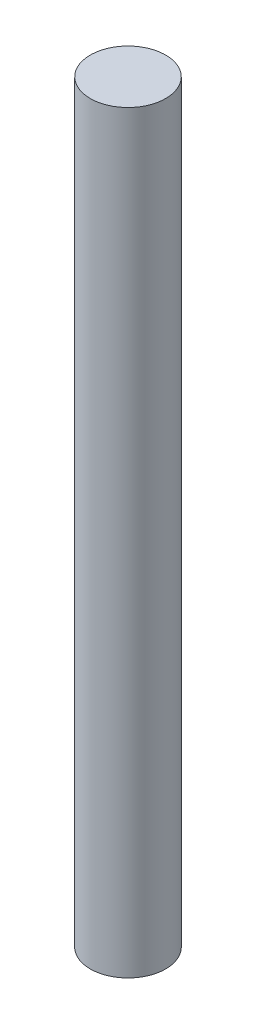
ISO-10303-21;
HEADER;
FILE_DESCRIPTION(('STEP AP214'),'2;1');
FILE_NAME('part.step','',(''),(''),'','','');
FILE_SCHEMA(('AUTOMOTIVE_DESIGN { 1 0 10303 214 1 1 1 1 }'));
ENDSEC;
DATA;
#1=APPLICATION_CONTEXT('core data for automotive mechanical design processes');
#2=APPLICATION_PROTOCOL_DEFINITION('international standard','automotive_design',2000,#1);
#3=PRODUCT_CONTEXT('',#1,'mechanical');
#4=PRODUCT('Part','Part','',(#3));
#5=PRODUCT_RELATED_PRODUCT_CATEGORY('part','',(#4));
#6=PRODUCT_DEFINITION_FORMATION('','',#4);
#7=PRODUCT_DEFINITION_CONTEXT('part definition',#1,'design');
#8=PRODUCT_DEFINITION('design','',#6,#7);
#9=PRODUCT_DEFINITION_SHAPE('','',#8);
#10=(LENGTH_UNIT() NAMED_UNIT(*) SI_UNIT(.MILLI.,.METRE.));
#11=(NAMED_UNIT(*) PLANE_ANGLE_UNIT() SI_UNIT($,.RADIAN.));
#12=(NAMED_UNIT(*) SI_UNIT($,.STERADIAN.) SOLID_ANGLE_UNIT());
#13=UNCERTAINTY_MEASURE_WITH_UNIT(LENGTH_MEASURE(1.E-05),#10,'distance_accuracy_value','');
#14=(GEOMETRIC_REPRESENTATION_CONTEXT(3) GLOBAL_UNCERTAINTY_ASSIGNED_CONTEXT((#13)) GLOBAL_UNIT_ASSIGNED_CONTEXT((#10,
#11,#12)) REPRESENTATION_CONTEXT('',''));
#15=CARTESIAN_POINT('',(0.,0.,0.));
#16=DIRECTION('',(0.,0.,1.));
#17=DIRECTION('',(1.,0.,0.));
#18=AXIS2_PLACEMENT_3D('',#15,#16,#17);
#19=CARTESIAN_POINT('',(-35.9589431918239,20.,-8.92314516241555));
#20=DIRECTION('',(0.,-1.,0.));
#21=DIRECTION('',(0.,0.,-1.));
#22=AXIS2_PLACEMENT_3D('',#19,#20,#21);
#23=CYLINDRICAL_SURFACE('',#22,0.999999999999998);
#24=CARTESIAN_POINT('',(-35.9589431918239,20.,-8.92314516241555));
#25=DIRECTION('',(0.,1.,0.));
#26=DIRECTION('',(0.,0.,1.));
#27=AXIS2_PLACEMENT_3D('',#24,#25,#26);
#28=CIRCLE('',#27,0.999999999999998);
#29=CARTESIAN_POINT('',(-35.9589431918239,20.,-7.92314516241555));
#30=VERTEX_POINT('',#29);
#31=EDGE_CURVE('E10',#30,#30,#28,.T.);
#32=ORIENTED_EDGE('',*,*,#31,.F.);
#33=EDGE_LOOP('',(#32));
#34=FACE_BOUND('',#33,.T.);
#35=CARTESIAN_POINT('',(-35.9589431918239,0.,-8.92314516241555));
#36=DIRECTION('',(0.,1.,0.));
#37=DIRECTION('',(0.,0.,1.));
#38=AXIS2_PLACEMENT_3D('',#35,#36,#37);
#39=CIRCLE('',#38,0.999999999999998);
#40=CARTESIAN_POINT('',(-35.9589431918239,0.,-7.92314516241555));
#41=VERTEX_POINT('',#40);
#42=EDGE_CURVE('E34',#41,#41,#39,.T.);
#43=ORIENTED_EDGE('',*,*,#42,.T.);
#44=EDGE_LOOP('',(#43));
#45=FACE_BOUND('',#44,.T.);
#46=ADVANCED_FACE('F31',(#34,#45),#23,.T.);
#47=CARTESIAN_POINT('',(-35.9589431918239,20.,-8.92314516241555));
#48=DIRECTION('',(0.,1.,0.));
#49=DIRECTION('',(0.,0.,1.));
#50=AXIS2_PLACEMENT_3D('',#47,#48,#49);
#51=PLANE('',#50);
#52=ORIENTED_EDGE('',*,*,#31,.T.);
#53=EDGE_LOOP('',(#52));
#54=FACE_BOUND('',#53,.T.);
#55=ADVANCED_FACE('F46',(#54),#51,.T.);
#56=CARTESIAN_POINT('',(-35.9589431918239,0.,-8.92314516241555));
#57=DIRECTION('',(0.,1.,0.));
#58=DIRECTION('',(0.,0.,1.));
#59=AXIS2_PLACEMENT_3D('',#56,#57,#58);
#60=PLANE('',#59);
#61=ORIENTED_EDGE('',*,*,#42,.F.);
#62=EDGE_LOOP('',(#61));
#63=FACE_BOUND('',#62,.T.);
#64=ADVANCED_FACE('F44',(#63),#60,.F.);
#65=CLOSED_SHELL('',(#46,#55,#64));
#66=MANIFOLD_SOLID_BREP('B2',#65);
#67=ADVANCED_BREP_SHAPE_REPRESENTATION('',(#18,#66),#14);
#68=SHAPE_DEFINITION_REPRESENTATION(#9,#67);
ENDSEC;
END-ISO-10303-21;
